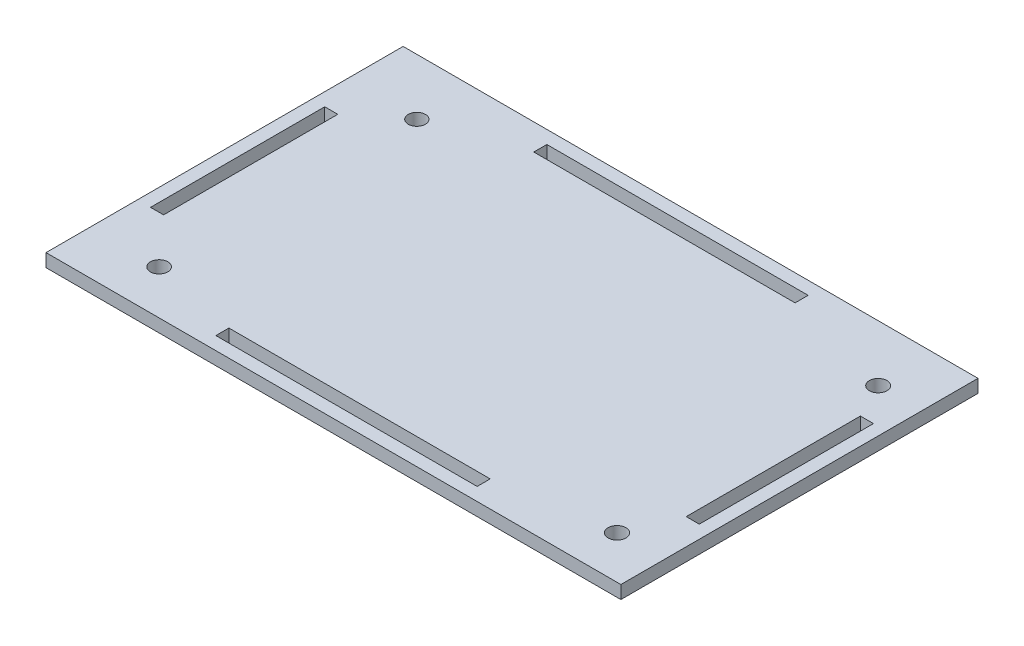
ISO-10303-21;
HEADER;
FILE_DESCRIPTION(('STEP AP214'),'2;1');
FILE_NAME('part.step','',(''),(''),'','','');
FILE_SCHEMA(('AUTOMOTIVE_DESIGN { 1 0 10303 214 1 1 1 1 }'));
ENDSEC;
DATA;
#1=APPLICATION_CONTEXT('core data for automotive mechanical design processes');
#2=APPLICATION_PROTOCOL_DEFINITION('international standard','automotive_design',2000,#1);
#3=PRODUCT_CONTEXT('',#1,'mechanical');
#4=PRODUCT('Part','Part','',(#3));
#5=PRODUCT_RELATED_PRODUCT_CATEGORY('part','',(#4));
#6=PRODUCT_DEFINITION_FORMATION('','',#4);
#7=PRODUCT_DEFINITION_CONTEXT('part definition',#1,'design');
#8=PRODUCT_DEFINITION('design','',#6,#7);
#9=PRODUCT_DEFINITION_SHAPE('','',#8);
#10=(LENGTH_UNIT() NAMED_UNIT(*) SI_UNIT(.MILLI.,.METRE.));
#11=(NAMED_UNIT(*) PLANE_ANGLE_UNIT() SI_UNIT($,.RADIAN.));
#12=(NAMED_UNIT(*) SI_UNIT($,.STERADIAN.) SOLID_ANGLE_UNIT());
#13=UNCERTAINTY_MEASURE_WITH_UNIT(LENGTH_MEASURE(1.E-05),#10,'distance_accuracy_value','');
#14=(GEOMETRIC_REPRESENTATION_CONTEXT(3) GLOBAL_UNCERTAINTY_ASSIGNED_CONTEXT((#13)) GLOBAL_UNIT_ASSIGNED_CONTEXT((#10,
#11,#12)) REPRESENTATION_CONTEXT('',''));
#15=CARTESIAN_POINT('',(0.,0.,0.));
#16=DIRECTION('',(0.,0.,1.));
#17=DIRECTION('',(1.,0.,0.));
#18=AXIS2_PLACEMENT_3D('',#15,#16,#17);
#19=CARTESIAN_POINT('',(0.,3.,0.));
#20=DIRECTION('',(0.,1.,0.));
#21=DIRECTION('',(0.,0.,1.));
#22=AXIS2_PLACEMENT_3D('',#19,#20,#21);
#23=PLANE('',#22);
#24=CARTESIAN_POINT('',(-4.72023304277999,3.,-3.8377562321309));
#25=DIRECTION('',(0.,1.,0.));
#26=DIRECTION('',(0.,0.,1.));
#27=AXIS2_PLACEMENT_3D('',#24,#25,#26);
#28=CIRCLE('',#27,2.04872441547933);
#29=CARTESIAN_POINT('',(-4.72023304277999,3.,-1.78903181665157));
#30=VERTEX_POINT('',#29);
#31=EDGE_CURVE('E652',#30,#30,#28,.T.);
#32=ORIENTED_EDGE('',*,*,#31,.F.);
#33=EDGE_LOOP('',(#32));
#34=FACE_BOUND('',#33,.T.);
#35=CARTESIAN_POINT('',(-110.18079739002,3.,-4.15478389289378));
#36=DIRECTION('',(0.,1.,0.));
#37=DIRECTION('',(0.,0.,1.));
#38=AXIS2_PLACEMENT_3D('',#35,#36,#37);
#39=CIRCLE('',#38,2.00652359482057);
#40=CARTESIAN_POINT('',(-110.18079739002,3.,-2.14826029807322));
#41=VERTEX_POINT('',#40);
#42=EDGE_CURVE('E222',#41,#41,#39,.T.);
#43=ORIENTED_EDGE('',*,*,#42,.F.);
#44=EDGE_LOOP('',(#43));
#45=FACE_BOUND('',#44,.T.);
#46=DIRECTION('',(0.,0.,-1.));
#47=VECTOR('',#46,1.);
#48=CARTESIAN_POINT('',(6.,3.,6.));
#49=LINE('',#48,#47);
#50=CARTESIAN_POINT('',(6.,3.,6.));
#51=VERTEX_POINT('',#50);
#52=CARTESIAN_POINT('',(6.,3.,-76.0000000000001));
#53=VERTEX_POINT('',#52);
#54=EDGE_CURVE('E367',#51,#53,#49,.T.);
#55=ORIENTED_EDGE('',*,*,#54,.T.);
#56=DIRECTION('',(-1.,0.,0.));
#57=VECTOR('',#56,1.);
#58=CARTESIAN_POINT('',(6.,3.,-76.0000000000001));
#59=LINE('',#58,#57);
#60=CARTESIAN_POINT('',(-126.,3.,-76.0000000000001));
#61=VERTEX_POINT('',#60);
#62=EDGE_CURVE('E371',#53,#61,#59,.T.);
#63=ORIENTED_EDGE('',*,*,#62,.T.);
#64=DIRECTION('',(0.,0.,1.));
#65=VECTOR('',#64,1.);
#66=CARTESIAN_POINT('',(-126.,3.,6.));
#67=LINE('',#66,#65);
#68=CARTESIAN_POINT('',(-126.,3.,6.));
#69=VERTEX_POINT('',#68);
#70=EDGE_CURVE('E375',#61,#69,#67,.T.);
#71=ORIENTED_EDGE('',*,*,#70,.T.);
#72=DIRECTION('',(1.,0.,0.));
#73=VECTOR('',#72,1.);
#74=CARTESIAN_POINT('',(6.,3.,6.));
#75=LINE('',#74,#73);
#76=EDGE_CURVE('E378',#69,#51,#75,.T.);
#77=ORIENTED_EDGE('',*,*,#76,.T.);
#78=EDGE_LOOP('',(#55,#63,#71,#77));
#79=FACE_BOUND('',#78,.T.);
#80=DIRECTION('',(1.,0.,0.));
#81=VECTOR('',#80,1.);
#82=CARTESIAN_POINT('',(3.00000000000001,3.,-15.));
#83=LINE('',#82,#81);
#84=CARTESIAN_POINT('',(0.,3.,-15.));
#85=VERTEX_POINT('',#84);
#86=CARTESIAN_POINT('',(3.00000000000001,3.,-15.));
#87=VERTEX_POINT('',#86);
#88=EDGE_CURVE('E327',#85,#87,#83,.T.);
#89=ORIENTED_EDGE('',*,*,#88,.F.);
#90=DIRECTION('',(0.,0.,1.));
#91=VECTOR('',#90,1.);
#92=CARTESIAN_POINT('',(0.,3.,-55.));
#93=LINE('',#92,#91);
#94=CARTESIAN_POINT('',(0.,3.,-55.));
#95=VERTEX_POINT('',#94);
#96=EDGE_CURVE('E324',#95,#85,#93,.T.);
#97=ORIENTED_EDGE('',*,*,#96,.F.);
#98=DIRECTION('',(-1.,0.,0.));
#99=VECTOR('',#98,1.);
#100=CARTESIAN_POINT('',(3.00000000000001,3.,-55.));
#101=LINE('',#100,#99);
#102=CARTESIAN_POINT('',(3.00000000000001,3.,-55.));
#103=VERTEX_POINT('',#102);
#104=EDGE_CURVE('E335',#103,#95,#101,.T.);
#105=ORIENTED_EDGE('',*,*,#104,.F.);
#106=DIRECTION('',(0.,0.,-1.));
#107=VECTOR('',#106,1.);
#108=CARTESIAN_POINT('',(3.00000000000001,3.,-55.));
#109=LINE('',#108,#107);
#110=EDGE_CURVE('E331',#87,#103,#109,.T.);
#111=ORIENTED_EDGE('',*,*,#110,.F.);
#112=EDGE_LOOP('',(#89,#97,#105,#111));
#113=FACE_BOUND('',#112,.T.);
#114=DIRECTION('',(-1.,0.,0.));
#115=VECTOR('',#114,1.);
#116=CARTESIAN_POINT('',(-123.,3.,-55.));
#117=LINE('',#116,#115);
#118=CARTESIAN_POINT('',(-120.,3.,-55.));
#119=VERTEX_POINT('',#118);
#120=CARTESIAN_POINT('',(-123.,3.,-55.));
#121=VERTEX_POINT('',#120);
#122=EDGE_CURVE('E284',#119,#121,#117,.T.);
#123=ORIENTED_EDGE('',*,*,#122,.F.);
#124=DIRECTION('',(0.,0.,-1.));
#125=VECTOR('',#124,1.);
#126=CARTESIAN_POINT('',(-120.,3.,-55.));
#127=LINE('',#126,#125);
#128=CARTESIAN_POINT('',(-120.,3.,-15.));
#129=VERTEX_POINT('',#128);
#130=EDGE_CURVE('E281',#129,#119,#127,.T.);
#131=ORIENTED_EDGE('',*,*,#130,.F.);
#132=DIRECTION('',(1.,0.,0.));
#133=VECTOR('',#132,1.);
#134=CARTESIAN_POINT('',(-123.,3.,-15.));
#135=LINE('',#134,#133);
#136=CARTESIAN_POINT('',(-123.,3.,-15.));
#137=VERTEX_POINT('',#136);
#138=EDGE_CURVE('E292',#137,#129,#135,.T.);
#139=ORIENTED_EDGE('',*,*,#138,.F.);
#140=DIRECTION('',(0.,0.,1.));
#141=VECTOR('',#140,1.);
#142=CARTESIAN_POINT('',(-123.,3.,-55.));
#143=LINE('',#142,#141);
#144=EDGE_CURVE('E288',#121,#137,#143,.T.);
#145=ORIENTED_EDGE('',*,*,#144,.F.);
#146=EDGE_LOOP('',(#123,#131,#139,#145));
#147=FACE_BOUND('',#146,.T.);
#148=DIRECTION('',(1.,0.,0.));
#149=VECTOR('',#148,1.);
#150=CARTESIAN_POINT('',(-29.9999999999999,3.,-70.));
#151=LINE('',#150,#149);
#152=CARTESIAN_POINT('',(-89.9999999999999,3.,-70.));
#153=VERTEX_POINT('',#152);
#154=CARTESIAN_POINT('',(-29.9999999999999,3.,-70.));
#155=VERTEX_POINT('',#154);
#156=EDGE_CURVE('E241',#153,#155,#151,.T.);
#157=ORIENTED_EDGE('',*,*,#156,.F.);
#158=DIRECTION('',(0.,0.,1.));
#159=VECTOR('',#158,1.);
#160=CARTESIAN_POINT('',(-89.9999999999999,3.,-73.0000000000001));
#161=LINE('',#160,#159);
#162=CARTESIAN_POINT('',(-89.9999999999999,3.,-73.0000000000001));
#163=VERTEX_POINT('',#162);
#164=EDGE_CURVE('E238',#163,#153,#161,.T.);
#165=ORIENTED_EDGE('',*,*,#164,.F.);
#166=DIRECTION('',(-1.,0.,0.));
#167=VECTOR('',#166,1.);
#168=CARTESIAN_POINT('',(-29.9999999999999,3.,-73.0000000000001));
#169=LINE('',#168,#167);
#170=CARTESIAN_POINT('',(-29.9999999999999,3.,-73.0000000000001));
#171=VERTEX_POINT('',#170);
#172=EDGE_CURVE('E249',#171,#163,#169,.T.);
#173=ORIENTED_EDGE('',*,*,#172,.F.);
#174=DIRECTION('',(0.,0.,-1.));
#175=VECTOR('',#174,1.);
#176=CARTESIAN_POINT('',(-29.9999999999999,3.,-73.0000000000001));
#177=LINE('',#176,#175);
#178=EDGE_CURVE('E245',#155,#171,#177,.T.);
#179=ORIENTED_EDGE('',*,*,#178,.F.);
#180=EDGE_LOOP('',(#157,#165,#173,#179));
#181=FACE_BOUND('',#180,.T.);
#182=DIRECTION('',(1.,0.,0.));
#183=VECTOR('',#182,1.);
#184=CARTESIAN_POINT('',(-30.,3.,3.00000000000003));
#185=LINE('',#184,#183);
#186=CARTESIAN_POINT('',(-90.,3.,3.00000000000004));
#187=VERTEX_POINT('',#186);
#188=CARTESIAN_POINT('',(-30.,3.,3.00000000000003));
#189=VERTEX_POINT('',#188);
#190=EDGE_CURVE('E196',#187,#189,#185,.T.);
#191=ORIENTED_EDGE('',*,*,#190,.F.);
#192=DIRECTION('',(0.,0.,1.));
#193=VECTOR('',#192,1.);
#194=CARTESIAN_POINT('',(-90.,3.,3.00000000000004));
#195=LINE('',#194,#193);
#196=CARTESIAN_POINT('',(-90.,3.,0.));
#197=VERTEX_POINT('',#196);
#198=EDGE_CURVE('E187',#197,#187,#195,.T.);
#199=ORIENTED_EDGE('',*,*,#198,.F.);
#200=DIRECTION('',(-1.,0.,0.));
#201=VECTOR('',#200,1.);
#202=CARTESIAN_POINT('',(-30.,3.,0.));
#203=LINE('',#202,#201);
#204=CARTESIAN_POINT('',(-30.,3.,0.));
#205=VERTEX_POINT('',#204);
#206=EDGE_CURVE('E214',#205,#197,#203,.T.);
#207=ORIENTED_EDGE('',*,*,#206,.F.);
#208=DIRECTION('',(0.,0.,-1.));
#209=VECTOR('',#208,1.);
#210=CARTESIAN_POINT('',(-30.,3.,3.00000000000003));
#211=LINE('',#210,#209);
#212=EDGE_CURVE('E210',#189,#205,#211,.T.);
#213=ORIENTED_EDGE('',*,*,#212,.F.);
#214=EDGE_LOOP('',(#191,#199,#207,#213));
#215=FACE_BOUND('',#214,.T.);
#216=CARTESIAN_POINT('',(-109.92679739002,3.,-63.0805400952193));
#217=DIRECTION('',(0.,1.,0.));
#218=DIRECTION('',(0.,0.,1.));
#219=AXIS2_PLACEMENT_3D('',#216,#217,#218);
#220=CIRCLE('',#219,1.97380108687728);
#221=CARTESIAN_POINT('',(-109.92679739002,3.,-61.106739008342));
#222=VERTEX_POINT('',#221);
#223=EDGE_CURVE('E660',#222,#222,#220,.T.);
#224=ORIENTED_EDGE('',*,*,#223,.F.);
#225=EDGE_LOOP('',(#224));
#226=FACE_BOUND('',#225,.T.);
#227=CARTESIAN_POINT('',(-4.00427744735476,3.,-63.0805400952193));
#228=DIRECTION('',(0.,1.,0.));
#229=DIRECTION('',(0.,0.,1.));
#230=AXIS2_PLACEMENT_3D('',#227,#228,#229);
#231=CIRCLE('',#230,2.02440774757698);
#232=CARTESIAN_POINT('',(-4.00427744735476,3.,-61.0561323476423));
#233=VERTEX_POINT('',#232);
#234=EDGE_CURVE('E641',#233,#233,#231,.T.);
#235=ORIENTED_EDGE('',*,*,#234,.F.);
#236=EDGE_LOOP('',(#235));
#237=FACE_BOUND('',#236,.T.);
#238=ADVANCED_FACE('F49',(#34,#45,#79,#113,#147,#181,#215,#226,#237),#23,.T.);
#239=CARTESIAN_POINT('',(0.,0.,0.));
#240=DIRECTION('',(0.,1.,0.));
#241=DIRECTION('',(0.,0.,1.));
#242=AXIS2_PLACEMENT_3D('',#239,#240,#241);
#243=PLANE('',#242);
#244=DIRECTION('',(0.,0.,1.));
#245=VECTOR('',#244,1.);
#246=CARTESIAN_POINT('',(-89.9999999999999,0.,-73.0000000000001));
#247=LINE('',#246,#245);
#248=CARTESIAN_POINT('',(-89.9999999999999,0.,-73.0000000000001));
#249=VERTEX_POINT('',#248);
#250=CARTESIAN_POINT('',(-89.9999999999999,0.,-70.));
#251=VERTEX_POINT('',#250);
#252=EDGE_CURVE('E205',#249,#251,#247,.T.);
#253=ORIENTED_EDGE('',*,*,#252,.T.);
#254=DIRECTION('',(1.,0.,0.));
#255=VECTOR('',#254,1.);
#256=CARTESIAN_POINT('',(-29.9999999999999,0.,-70.));
#257=LINE('',#256,#255);
#258=CARTESIAN_POINT('',(-29.9999999999999,0.,-70.));
#259=VERTEX_POINT('',#258);
#260=EDGE_CURVE('E256',#251,#259,#257,.T.);
#261=ORIENTED_EDGE('',*,*,#260,.T.);
#262=DIRECTION('',(0.,0.,-1.));
#263=VECTOR('',#262,1.);
#264=CARTESIAN_POINT('',(-29.9999999999999,0.,-73.0000000000001));
#265=LINE('',#264,#263);
#266=CARTESIAN_POINT('',(-29.9999999999999,0.,-73.0000000000001));
#267=VERTEX_POINT('',#266);
#268=EDGE_CURVE('E260',#259,#267,#265,.T.);
#269=ORIENTED_EDGE('',*,*,#268,.T.);
#270=DIRECTION('',(-1.,0.,0.));
#271=VECTOR('',#270,1.);
#272=CARTESIAN_POINT('',(-29.9999999999999,0.,-73.0000000000001));
#273=LINE('',#272,#271);
#274=EDGE_CURVE('E242',#267,#249,#273,.T.);
#275=ORIENTED_EDGE('',*,*,#274,.T.);
#276=EDGE_LOOP('',(#253,#261,#269,#275));
#277=FACE_BOUND('',#276,.T.);
#278=DIRECTION('',(0.,0.,1.));
#279=VECTOR('',#278,1.);
#280=CARTESIAN_POINT('',(0.,0.,-55.));
#281=LINE('',#280,#279);
#282=CARTESIAN_POINT('',(0.,0.,-55.));
#283=VERTEX_POINT('',#282);
#284=CARTESIAN_POINT('',(0.,0.,-15.));
#285=VERTEX_POINT('',#284);
#286=EDGE_CURVE('E323',#283,#285,#281,.T.);
#287=ORIENTED_EDGE('',*,*,#286,.T.);
#288=DIRECTION('',(1.,0.,0.));
#289=VECTOR('',#288,1.);
#290=CARTESIAN_POINT('',(3.00000000000001,0.,-15.));
#291=LINE('',#290,#289);
#292=CARTESIAN_POINT('',(3.00000000000001,0.,-15.));
#293=VERTEX_POINT('',#292);
#294=EDGE_CURVE('E342',#285,#293,#291,.T.);
#295=ORIENTED_EDGE('',*,*,#294,.T.);
#296=DIRECTION('',(0.,0.,-1.));
#297=VECTOR('',#296,1.);
#298=CARTESIAN_POINT('',(3.00000000000001,0.,-55.));
#299=LINE('',#298,#297);
#300=CARTESIAN_POINT('',(3.00000000000001,0.,-55.));
#301=VERTEX_POINT('',#300);
#302=EDGE_CURVE('E346',#293,#301,#299,.T.);
#303=ORIENTED_EDGE('',*,*,#302,.T.);
#304=DIRECTION('',(-1.,0.,0.));
#305=VECTOR('',#304,1.);
#306=CARTESIAN_POINT('',(3.00000000000001,0.,-55.));
#307=LINE('',#306,#305);
#308=EDGE_CURVE('E328',#301,#283,#307,.T.);
#309=ORIENTED_EDGE('',*,*,#308,.T.);
#310=EDGE_LOOP('',(#287,#295,#303,#309));
#311=FACE_BOUND('',#310,.T.);
#312=DIRECTION('',(0.,0.,-1.));
#313=VECTOR('',#312,1.);
#314=CARTESIAN_POINT('',(6.,0.,6.));
#315=LINE('',#314,#313);
#316=CARTESIAN_POINT('',(6.,0.,6.));
#317=VERTEX_POINT('',#316);
#318=CARTESIAN_POINT('',(6.,0.,-76.0000000000001));
#319=VERTEX_POINT('',#318);
#320=EDGE_CURVE('E366',#317,#319,#315,.T.);
#321=ORIENTED_EDGE('',*,*,#320,.F.);
#322=DIRECTION('',(1.,0.,0.));
#323=VECTOR('',#322,1.);
#324=CARTESIAN_POINT('',(6.,0.,6.));
#325=LINE('',#324,#323);
#326=CARTESIAN_POINT('',(-126.,0.,6.));
#327=VERTEX_POINT('',#326);
#328=EDGE_CURVE('E372',#327,#317,#325,.T.);
#329=ORIENTED_EDGE('',*,*,#328,.F.);
#330=DIRECTION('',(0.,0.,1.));
#331=VECTOR('',#330,1.);
#332=CARTESIAN_POINT('',(-126.,0.,6.));
#333=LINE('',#332,#331);
#334=CARTESIAN_POINT('',(-126.,0.,-76.0000000000001));
#335=VERTEX_POINT('',#334);
#336=EDGE_CURVE('E388',#335,#327,#333,.T.);
#337=ORIENTED_EDGE('',*,*,#336,.F.);
#338=DIRECTION('',(-1.,0.,0.));
#339=VECTOR('',#338,1.);
#340=CARTESIAN_POINT('',(6.,0.,-76.0000000000001));
#341=LINE('',#340,#339);
#342=EDGE_CURVE('E385',#319,#335,#341,.T.);
#343=ORIENTED_EDGE('',*,*,#342,.F.);
#344=EDGE_LOOP('',(#321,#329,#337,#343));
#345=FACE_BOUND('',#344,.T.);
#346=DIRECTION('',(0.,0.,-1.));
#347=VECTOR('',#346,1.);
#348=CARTESIAN_POINT('',(-120.,0.,-55.));
#349=LINE('',#348,#347);
#350=CARTESIAN_POINT('',(-120.,0.,-15.));
#351=VERTEX_POINT('',#350);
#352=CARTESIAN_POINT('',(-120.,0.,-55.));
#353=VERTEX_POINT('',#352);
#354=EDGE_CURVE('E280',#351,#353,#349,.T.);
#355=ORIENTED_EDGE('',*,*,#354,.T.);
#356=DIRECTION('',(-1.,0.,0.));
#357=VECTOR('',#356,1.);
#358=CARTESIAN_POINT('',(-123.,0.,-55.));
#359=LINE('',#358,#357);
#360=CARTESIAN_POINT('',(-123.,0.,-55.));
#361=VERTEX_POINT('',#360);
#362=EDGE_CURVE('E299',#353,#361,#359,.T.);
#363=ORIENTED_EDGE('',*,*,#362,.T.);
#364=DIRECTION('',(0.,0.,1.));
#365=VECTOR('',#364,1.);
#366=CARTESIAN_POINT('',(-123.,0.,-55.));
#367=LINE('',#366,#365);
#368=CARTESIAN_POINT('',(-123.,0.,-15.));
#369=VERTEX_POINT('',#368);
#370=EDGE_CURVE('E303',#361,#369,#367,.T.);
#371=ORIENTED_EDGE('',*,*,#370,.T.);
#372=DIRECTION('',(1.,0.,0.));
#373=VECTOR('',#372,1.);
#374=CARTESIAN_POINT('',(-123.,0.,-15.));
#375=LINE('',#374,#373);
#376=EDGE_CURVE('E285',#369,#351,#375,.T.);
#377=ORIENTED_EDGE('',*,*,#376,.T.);
#378=EDGE_LOOP('',(#355,#363,#371,#377));
#379=FACE_BOUND('',#378,.T.);
#380=DIRECTION('',(0.,0.,1.));
#381=VECTOR('',#380,1.);
#382=CARTESIAN_POINT('',(-90.,0.,3.00000000000004));
#383=LINE('',#382,#381);
#384=CARTESIAN_POINT('',(-90.,0.,0.));
#385=VERTEX_POINT('',#384);
#386=CARTESIAN_POINT('',(-90.,0.,3.00000000000004));
#387=VERTEX_POINT('',#386);
#388=EDGE_CURVE('E73',#385,#387,#383,.T.);
#389=ORIENTED_EDGE('',*,*,#388,.T.);
#390=DIRECTION('',(1.,0.,0.));
#391=VECTOR('',#390,1.);
#392=CARTESIAN_POINT('',(-30.,0.,3.00000000000003));
#393=LINE('',#392,#391);
#394=CARTESIAN_POINT('',(-30.,0.,3.00000000000003));
#395=VERTEX_POINT('',#394);
#396=EDGE_CURVE('E203',#387,#395,#393,.T.);
#397=ORIENTED_EDGE('',*,*,#396,.T.);
#398=DIRECTION('',(0.,0.,-1.));
#399=VECTOR('',#398,1.);
#400=CARTESIAN_POINT('',(-30.,0.,3.00000000000003));
#401=LINE('',#400,#399);
#402=CARTESIAN_POINT('',(-30.,0.,0.));
#403=VERTEX_POINT('',#402);
#404=EDGE_CURVE('E225',#395,#403,#401,.T.);
#405=ORIENTED_EDGE('',*,*,#404,.T.);
#406=DIRECTION('',(-1.,0.,0.));
#407=VECTOR('',#406,1.);
#408=CARTESIAN_POINT('',(-30.,0.,0.));
#409=LINE('',#408,#407);
#410=EDGE_CURVE('E197',#403,#385,#409,.T.);
#411=ORIENTED_EDGE('',*,*,#410,.T.);
#412=EDGE_LOOP('',(#389,#397,#405,#411));
#413=FACE_BOUND('',#412,.T.);
#414=CARTESIAN_POINT('',(-110.18079739002,0.,-4.15478389289378));
#415=DIRECTION('',(0.,1.,0.));
#416=DIRECTION('',(0.,0.,1.));
#417=AXIS2_PLACEMENT_3D('',#414,#415,#416);
#418=CIRCLE('',#417,2.00652359482057);
#419=CARTESIAN_POINT('',(-110.18079739002,0.,-2.14826029807322));
#420=VERTEX_POINT('',#419);
#421=EDGE_CURVE('E664',#420,#420,#418,.T.);
#422=ORIENTED_EDGE('',*,*,#421,.T.);
#423=EDGE_LOOP('',(#422));
#424=FACE_BOUND('',#423,.T.);
#425=CARTESIAN_POINT('',(-109.92679739002,0.,-63.0805400952193));
#426=DIRECTION('',(0.,1.,0.));
#427=DIRECTION('',(0.,0.,1.));
#428=AXIS2_PLACEMENT_3D('',#425,#426,#427);
#429=CIRCLE('',#428,1.97380108687728);
#430=CARTESIAN_POINT('',(-109.92679739002,0.,-61.106739008342));
#431=VERTEX_POINT('',#430);
#432=EDGE_CURVE('E656',#431,#431,#429,.T.);
#433=ORIENTED_EDGE('',*,*,#432,.T.);
#434=EDGE_LOOP('',(#433));
#435=FACE_BOUND('',#434,.T.);
#436=CARTESIAN_POINT('',(-4.72023304277999,0.,-3.8377562321309));
#437=DIRECTION('',(0.,1.,0.));
#438=DIRECTION('',(0.,0.,1.));
#439=AXIS2_PLACEMENT_3D('',#436,#437,#438);
#440=CIRCLE('',#439,2.04872441547933);
#441=CARTESIAN_POINT('',(-4.72023304277999,0.,-1.78903181665157));
#442=VERTEX_POINT('',#441);
#443=EDGE_CURVE('E649',#442,#442,#440,.T.);
#444=ORIENTED_EDGE('',*,*,#443,.T.);
#445=EDGE_LOOP('',(#444));
#446=FACE_BOUND('',#445,.T.);
#447=CARTESIAN_POINT('',(-4.00427744735476,0.,-63.0805400952193));
#448=DIRECTION('',(0.,1.,0.));
#449=DIRECTION('',(0.,0.,1.));
#450=AXIS2_PLACEMENT_3D('',#447,#448,#449);
#451=CIRCLE('',#450,2.02440774757698);
#452=CARTESIAN_POINT('',(-4.00427744735476,0.,-61.0561323476423));
#453=VERTEX_POINT('',#452);
#454=EDGE_CURVE('E644',#453,#453,#451,.T.);
#455=ORIENTED_EDGE('',*,*,#454,.T.);
#456=EDGE_LOOP('',(#455));
#457=FACE_BOUND('',#456,.T.);
#458=ADVANCED_FACE('F411',(#277,#311,#345,#379,#413,#424,#435,#446,#457),#243,.F.);
#459=CARTESIAN_POINT('',(6.,3.,6.));
#460=DIRECTION('',(-1.,0.,0.));
#461=DIRECTION('',(0.,0.,1.));
#462=AXIS2_PLACEMENT_3D('',#459,#460,#461);
#463=PLANE('',#462);
#464=ORIENTED_EDGE('',*,*,#320,.T.);
#465=DIRECTION('',(0.,-1.,0.));
#466=VECTOR('',#465,1.);
#467=CARTESIAN_POINT('',(6.,3.,-76.0000000000001));
#468=LINE('',#467,#466);
#469=EDGE_CURVE('E13',#53,#319,#468,.T.);
#470=ORIENTED_EDGE('',*,*,#469,.F.);
#471=ORIENTED_EDGE('',*,*,#54,.F.);
#472=DIRECTION('',(0.,-1.,0.));
#473=VECTOR('',#472,1.);
#474=CARTESIAN_POINT('',(6.,3.,6.));
#475=LINE('',#474,#473);
#476=EDGE_CURVE('E381',#51,#317,#475,.T.);
#477=ORIENTED_EDGE('',*,*,#476,.T.);
#478=EDGE_LOOP('',(#464,#470,#471,#477));
#479=FACE_BOUND('',#478,.T.);
#480=ADVANCED_FACE('F51',(#479),#463,.F.);
#481=CARTESIAN_POINT('',(6.,3.,-76.0000000000001));
#482=DIRECTION('',(0.,0.,1.));
#483=DIRECTION('',(1.,0.,0.));
#484=AXIS2_PLACEMENT_3D('',#481,#482,#483);
#485=PLANE('',#484);
#486=ORIENTED_EDGE('',*,*,#342,.T.);
#487=DIRECTION('',(0.,-1.,0.));
#488=VECTOR('',#487,1.);
#489=CARTESIAN_POINT('',(-126.,3.,-76.0000000000001));
#490=LINE('',#489,#488);
#491=EDGE_CURVE('E58',#61,#335,#490,.T.);
#492=ORIENTED_EDGE('',*,*,#491,.F.);
#493=ORIENTED_EDGE('',*,*,#62,.F.);
#494=ORIENTED_EDGE('',*,*,#469,.T.);
#495=EDGE_LOOP('',(#486,#492,#493,#494));
#496=FACE_BOUND('',#495,.T.);
#497=ADVANCED_FACE('F422',(#496),#485,.F.);
#498=CARTESIAN_POINT('',(-126.,3.,6.));
#499=DIRECTION('',(1.,0.,0.));
#500=DIRECTION('',(0.,0.,-1.));
#501=AXIS2_PLACEMENT_3D('',#498,#499,#500);
#502=PLANE('',#501);
#503=ORIENTED_EDGE('',*,*,#336,.T.);
#504=DIRECTION('',(0.,-1.,0.));
#505=VECTOR('',#504,1.);
#506=CARTESIAN_POINT('',(-126.,3.,6.));
#507=LINE('',#506,#505);
#508=EDGE_CURVE('E396',#69,#327,#507,.T.);
#509=ORIENTED_EDGE('',*,*,#508,.F.);
#510=ORIENTED_EDGE('',*,*,#70,.F.);
#511=ORIENTED_EDGE('',*,*,#491,.T.);
#512=EDGE_LOOP('',(#503,#509,#510,#511));
#513=FACE_BOUND('',#512,.T.);
#514=ADVANCED_FACE('F405',(#513),#502,.F.);
#515=CARTESIAN_POINT('',(6.,3.,6.));
#516=DIRECTION('',(0.,0.,-1.));
#517=DIRECTION('',(-1.,0.,0.));
#518=AXIS2_PLACEMENT_3D('',#515,#516,#517);
#519=PLANE('',#518);
#520=ORIENTED_EDGE('',*,*,#328,.T.);
#521=ORIENTED_EDGE('',*,*,#476,.F.);
#522=ORIENTED_EDGE('',*,*,#76,.F.);
#523=ORIENTED_EDGE('',*,*,#508,.T.);
#524=EDGE_LOOP('',(#520,#521,#522,#523));
#525=FACE_BOUND('',#524,.T.);
#526=ADVANCED_FACE('F415',(#525),#519,.F.);
#527=CARTESIAN_POINT('',(0.,3.,-55.));
#528=DIRECTION('',(1.,0.,0.));
#529=DIRECTION('',(0.,0.,-1.));
#530=AXIS2_PLACEMENT_3D('',#527,#528,#529);
#531=PLANE('',#530);
#532=ORIENTED_EDGE('',*,*,#286,.F.);
#533=DIRECTION('',(0.,-1.,0.));
#534=VECTOR('',#533,1.);
#535=CARTESIAN_POINT('',(0.,3.,-55.));
#536=LINE('',#535,#534);
#537=EDGE_CURVE('E338',#95,#283,#536,.T.);
#538=ORIENTED_EDGE('',*,*,#537,.F.);
#539=ORIENTED_EDGE('',*,*,#96,.T.);
#540=DIRECTION('',(0.,-1.,0.));
#541=VECTOR('',#540,1.);
#542=CARTESIAN_POINT('',(0.,3.,-15.));
#543=LINE('',#542,#541);
#544=EDGE_CURVE('E362',#85,#285,#543,.T.);
#545=ORIENTED_EDGE('',*,*,#544,.T.);
#546=EDGE_LOOP('',(#532,#538,#539,#545));
#547=FACE_BOUND('',#546,.T.);
#548=ADVANCED_FACE('F440',(#547),#531,.T.);
#549=CARTESIAN_POINT('',(3.00000000000001,3.,-15.));
#550=DIRECTION('',(0.,0.,-1.));
#551=DIRECTION('',(-1.,0.,0.));
#552=AXIS2_PLACEMENT_3D('',#549,#550,#551);
#553=PLANE('',#552);
#554=ORIENTED_EDGE('',*,*,#294,.F.);
#555=ORIENTED_EDGE('',*,*,#544,.F.);
#556=ORIENTED_EDGE('',*,*,#88,.T.);
#557=DIRECTION('',(0.,-1.,0.));
#558=VECTOR('',#557,1.);
#559=CARTESIAN_POINT('',(3.00000000000001,3.,-15.));
#560=LINE('',#559,#558);
#561=EDGE_CURVE('E359',#87,#293,#560,.T.);
#562=ORIENTED_EDGE('',*,*,#561,.T.);
#563=EDGE_LOOP('',(#554,#555,#556,#562));
#564=FACE_BOUND('',#563,.T.);
#565=ADVANCED_FACE('F447',(#564),#553,.T.);
#566=CARTESIAN_POINT('',(3.00000000000001,3.,-55.));
#567=DIRECTION('',(-1.,0.,0.));
#568=DIRECTION('',(0.,0.,1.));
#569=AXIS2_PLACEMENT_3D('',#566,#567,#568);
#570=PLANE('',#569);
#571=ORIENTED_EDGE('',*,*,#302,.F.);
#572=ORIENTED_EDGE('',*,*,#561,.F.);
#573=ORIENTED_EDGE('',*,*,#110,.T.);
#574=DIRECTION('',(0.,-1.,0.));
#575=VECTOR('',#574,1.);
#576=CARTESIAN_POINT('',(3.00000000000001,3.,-55.));
#577=LINE('',#576,#575);
#578=EDGE_CURVE('E356',#103,#301,#577,.T.);
#579=ORIENTED_EDGE('',*,*,#578,.T.);
#580=EDGE_LOOP('',(#571,#572,#573,#579));
#581=FACE_BOUND('',#580,.T.);
#582=ADVANCED_FACE('F452',(#581),#570,.T.);
#583=CARTESIAN_POINT('',(3.00000000000001,3.,-55.));
#584=DIRECTION('',(0.,0.,1.));
#585=DIRECTION('',(1.,0.,0.));
#586=AXIS2_PLACEMENT_3D('',#583,#584,#585);
#587=PLANE('',#586);
#588=ORIENTED_EDGE('',*,*,#308,.F.);
#589=ORIENTED_EDGE('',*,*,#578,.F.);
#590=ORIENTED_EDGE('',*,*,#104,.T.);
#591=ORIENTED_EDGE('',*,*,#537,.T.);
#592=EDGE_LOOP('',(#588,#589,#590,#591));
#593=FACE_BOUND('',#592,.T.);
#594=ADVANCED_FACE('F460',(#593),#587,.T.);
#595=CARTESIAN_POINT('',(-120.,3.,-55.));
#596=DIRECTION('',(-1.,0.,0.));
#597=DIRECTION('',(0.,0.,1.));
#598=AXIS2_PLACEMENT_3D('',#595,#596,#597);
#599=PLANE('',#598);
#600=ORIENTED_EDGE('',*,*,#354,.F.);
#601=DIRECTION('',(0.,-1.,0.));
#602=VECTOR('',#601,1.);
#603=CARTESIAN_POINT('',(-120.,3.,-15.));
#604=LINE('',#603,#602);
#605=EDGE_CURVE('E295',#129,#351,#604,.T.);
#606=ORIENTED_EDGE('',*,*,#605,.F.);
#607=ORIENTED_EDGE('',*,*,#130,.T.);
#608=DIRECTION('',(0.,-1.,0.));
#609=VECTOR('',#608,1.);
#610=CARTESIAN_POINT('',(-120.,3.,-55.));
#611=LINE('',#610,#609);
#612=EDGE_CURVE('E319',#119,#353,#611,.T.);
#613=ORIENTED_EDGE('',*,*,#612,.T.);
#614=EDGE_LOOP('',(#600,#606,#607,#613));
#615=FACE_BOUND('',#614,.T.);
#616=ADVANCED_FACE('F514',(#615),#599,.T.);
#617=CARTESIAN_POINT('',(-123.,3.,-55.));
#618=DIRECTION('',(0.,0.,1.));
#619=DIRECTION('',(1.,0.,0.));
#620=AXIS2_PLACEMENT_3D('',#617,#618,#619);
#621=PLANE('',#620);
#622=ORIENTED_EDGE('',*,*,#362,.F.);
#623=ORIENTED_EDGE('',*,*,#612,.F.);
#624=ORIENTED_EDGE('',*,*,#122,.T.);
#625=DIRECTION('',(0.,-1.,0.));
#626=VECTOR('',#625,1.);
#627=CARTESIAN_POINT('',(-123.,3.,-55.));
#628=LINE('',#627,#626);
#629=EDGE_CURVE('E316',#121,#361,#628,.T.);
#630=ORIENTED_EDGE('',*,*,#629,.T.);
#631=EDGE_LOOP('',(#622,#623,#624,#630));
#632=FACE_BOUND('',#631,.T.);
#633=ADVANCED_FACE('F510',(#632),#621,.T.);
#634=CARTESIAN_POINT('',(-123.,3.,-55.));
#635=DIRECTION('',(1.,0.,0.));
#636=DIRECTION('',(0.,0.,-1.));
#637=AXIS2_PLACEMENT_3D('',#634,#635,#636);
#638=PLANE('',#637);
#639=ORIENTED_EDGE('',*,*,#370,.F.);
#640=ORIENTED_EDGE('',*,*,#629,.F.);
#641=ORIENTED_EDGE('',*,*,#144,.T.);
#642=DIRECTION('',(0.,-1.,0.));
#643=VECTOR('',#642,1.);
#644=CARTESIAN_POINT('',(-123.,3.,-15.));
#645=LINE('',#644,#643);
#646=EDGE_CURVE('E313',#137,#369,#645,.T.);
#647=ORIENTED_EDGE('',*,*,#646,.T.);
#648=EDGE_LOOP('',(#639,#640,#641,#647));
#649=FACE_BOUND('',#648,.T.);
#650=ADVANCED_FACE('F506',(#649),#638,.T.);
#651=CARTESIAN_POINT('',(-123.,3.,-15.));
#652=DIRECTION('',(0.,0.,-1.));
#653=DIRECTION('',(-1.,0.,0.));
#654=AXIS2_PLACEMENT_3D('',#651,#652,#653);
#655=PLANE('',#654);
#656=ORIENTED_EDGE('',*,*,#376,.F.);
#657=ORIENTED_EDGE('',*,*,#646,.F.);
#658=ORIENTED_EDGE('',*,*,#138,.T.);
#659=ORIENTED_EDGE('',*,*,#605,.T.);
#660=EDGE_LOOP('',(#656,#657,#658,#659));
#661=FACE_BOUND('',#660,.T.);
#662=ADVANCED_FACE('F503',(#661),#655,.T.);
#663=CARTESIAN_POINT('',(-89.9999999999999,3.,-73.0000000000001));
#664=DIRECTION('',(1.,0.,0.));
#665=DIRECTION('',(0.,0.,-1.));
#666=AXIS2_PLACEMENT_3D('',#663,#664,#665);
#667=PLANE('',#666);
#668=ORIENTED_EDGE('',*,*,#252,.F.);
#669=DIRECTION('',(0.,-1.,0.));
#670=VECTOR('',#669,1.);
#671=CARTESIAN_POINT('',(-89.9999999999999,3.,-73.0000000000001));
#672=LINE('',#671,#670);
#673=EDGE_CURVE('E252',#163,#249,#672,.T.);
#674=ORIENTED_EDGE('',*,*,#673,.F.);
#675=ORIENTED_EDGE('',*,*,#164,.T.);
#676=DIRECTION('',(0.,-1.,0.));
#677=VECTOR('',#676,1.);
#678=CARTESIAN_POINT('',(-89.9999999999999,3.,-70.));
#679=LINE('',#678,#677);
#680=EDGE_CURVE('E276',#153,#251,#679,.T.);
#681=ORIENTED_EDGE('',*,*,#680,.T.);
#682=EDGE_LOOP('',(#668,#674,#675,#681));
#683=FACE_BOUND('',#682,.T.);
#684=ADVANCED_FACE('F485',(#683),#667,.T.);
#685=CARTESIAN_POINT('',(-29.9999999999999,3.,-70.));
#686=DIRECTION('',(0.,0.,-1.));
#687=DIRECTION('',(-1.,0.,0.));
#688=AXIS2_PLACEMENT_3D('',#685,#686,#687);
#689=PLANE('',#688);
#690=ORIENTED_EDGE('',*,*,#260,.F.);
#691=ORIENTED_EDGE('',*,*,#680,.F.);
#692=ORIENTED_EDGE('',*,*,#156,.T.);
#693=DIRECTION('',(0.,-1.,0.));
#694=VECTOR('',#693,1.);
#695=CARTESIAN_POINT('',(-29.9999999999999,3.,-70.));
#696=LINE('',#695,#694);
#697=EDGE_CURVE('E273',#155,#259,#696,.T.);
#698=ORIENTED_EDGE('',*,*,#697,.T.);
#699=EDGE_LOOP('',(#690,#691,#692,#698));
#700=FACE_BOUND('',#699,.T.);
#701=ADVANCED_FACE('F479',(#700),#689,.T.);
#702=CARTESIAN_POINT('',(-29.9999999999999,3.,-73.0000000000001));
#703=DIRECTION('',(-1.,0.,0.));
#704=DIRECTION('',(0.,0.,1.));
#705=AXIS2_PLACEMENT_3D('',#702,#703,#704);
#706=PLANE('',#705);
#707=ORIENTED_EDGE('',*,*,#268,.F.);
#708=ORIENTED_EDGE('',*,*,#697,.F.);
#709=ORIENTED_EDGE('',*,*,#178,.T.);
#710=DIRECTION('',(0.,-1.,0.));
#711=VECTOR('',#710,1.);
#712=CARTESIAN_POINT('',(-29.9999999999999,3.,-73.0000000000001));
#713=LINE('',#712,#711);
#714=EDGE_CURVE('E270',#171,#267,#713,.T.);
#715=ORIENTED_EDGE('',*,*,#714,.T.);
#716=EDGE_LOOP('',(#707,#708,#709,#715));
#717=FACE_BOUND('',#716,.T.);
#718=ADVANCED_FACE('F482',(#717),#706,.T.);
#719=CARTESIAN_POINT('',(-29.9999999999999,3.,-73.0000000000001));
#720=DIRECTION('',(0.,0.,1.));
#721=DIRECTION('',(1.,0.,0.));
#722=AXIS2_PLACEMENT_3D('',#719,#720,#721);
#723=PLANE('',#722);
#724=ORIENTED_EDGE('',*,*,#274,.F.);
#725=ORIENTED_EDGE('',*,*,#714,.F.);
#726=ORIENTED_EDGE('',*,*,#172,.T.);
#727=ORIENTED_EDGE('',*,*,#673,.T.);
#728=EDGE_LOOP('',(#724,#725,#726,#727));
#729=FACE_BOUND('',#728,.T.);
#730=ADVANCED_FACE('F488',(#729),#723,.T.);
#731=CARTESIAN_POINT('',(-90.,3.,3.00000000000004));
#732=DIRECTION('',(1.,0.,0.));
#733=DIRECTION('',(0.,0.,-1.));
#734=AXIS2_PLACEMENT_3D('',#731,#732,#733);
#735=PLANE('',#734);
#736=ORIENTED_EDGE('',*,*,#388,.F.);
#737=DIRECTION('',(0.,-1.,0.));
#738=VECTOR('',#737,1.);
#739=CARTESIAN_POINT('',(-90.,3.,0.));
#740=LINE('',#739,#738);
#741=EDGE_CURVE('E191',#197,#385,#740,.T.);
#742=ORIENTED_EDGE('',*,*,#741,.F.);
#743=ORIENTED_EDGE('',*,*,#198,.T.);
#744=DIRECTION('',(0.,-1.,0.));
#745=VECTOR('',#744,1.);
#746=CARTESIAN_POINT('',(-90.,3.,3.00000000000004));
#747=LINE('',#746,#745);
#748=EDGE_CURVE('E190',#187,#387,#747,.T.);
#749=ORIENTED_EDGE('',*,*,#748,.T.);
#750=EDGE_LOOP('',(#736,#742,#743,#749));
#751=FACE_BOUND('',#750,.T.);
#752=ADVANCED_FACE('F189',(#751),#735,.T.);
#753=CARTESIAN_POINT('',(-30.,3.,3.00000000000003));
#754=DIRECTION('',(0.,0.,-1.));
#755=DIRECTION('',(-1.,0.,0.));
#756=AXIS2_PLACEMENT_3D('',#753,#754,#755);
#757=PLANE('',#756);
#758=ORIENTED_EDGE('',*,*,#396,.F.);
#759=ORIENTED_EDGE('',*,*,#748,.F.);
#760=ORIENTED_EDGE('',*,*,#190,.T.);
#761=DIRECTION('',(0.,-1.,0.));
#762=VECTOR('',#761,1.);
#763=CARTESIAN_POINT('',(-30.,3.,3.00000000000003));
#764=LINE('',#763,#762);
#765=EDGE_CURVE('E206',#189,#395,#764,.T.);
#766=ORIENTED_EDGE('',*,*,#765,.T.);
#767=EDGE_LOOP('',(#758,#759,#760,#766));
#768=FACE_BOUND('',#767,.T.);
#769=ADVANCED_FACE('F200',(#768),#757,.T.);
#770=CARTESIAN_POINT('',(-30.,3.,3.00000000000003));
#771=DIRECTION('',(-1.,0.,0.));
#772=DIRECTION('',(0.,0.,1.));
#773=AXIS2_PLACEMENT_3D('',#770,#771,#772);
#774=PLANE('',#773);
#775=ORIENTED_EDGE('',*,*,#404,.F.);
#776=ORIENTED_EDGE('',*,*,#765,.F.);
#777=ORIENTED_EDGE('',*,*,#212,.T.);
#778=DIRECTION('',(0.,-1.,0.));
#779=VECTOR('',#778,1.);
#780=CARTESIAN_POINT('',(-30.,3.,0.));
#781=LINE('',#780,#779);
#782=EDGE_CURVE('E65',#205,#403,#781,.T.);
#783=ORIENTED_EDGE('',*,*,#782,.T.);
#784=EDGE_LOOP('',(#775,#776,#777,#783));
#785=FACE_BOUND('',#784,.T.);
#786=ADVANCED_FACE('F577',(#785),#774,.T.);
#787=CARTESIAN_POINT('',(-30.,3.,0.));
#788=DIRECTION('',(0.,0.,1.));
#789=DIRECTION('',(1.,0.,0.));
#790=AXIS2_PLACEMENT_3D('',#787,#788,#789);
#791=PLANE('',#790);
#792=ORIENTED_EDGE('',*,*,#410,.F.);
#793=ORIENTED_EDGE('',*,*,#782,.F.);
#794=ORIENTED_EDGE('',*,*,#206,.T.);
#795=ORIENTED_EDGE('',*,*,#741,.T.);
#796=EDGE_LOOP('',(#792,#793,#794,#795));
#797=FACE_BOUND('',#796,.T.);
#798=ADVANCED_FACE('F585',(#797),#791,.T.);
#799=CARTESIAN_POINT('',(-110.18079739002,3.,-4.15478389289378));
#800=DIRECTION('',(0.,-1.,0.));
#801=DIRECTION('',(0.,0.,-1.));
#802=AXIS2_PLACEMENT_3D('',#799,#800,#801);
#803=CYLINDRICAL_SURFACE('',#802,2.00652359482057);
#804=ORIENTED_EDGE('',*,*,#42,.T.);
#805=EDGE_LOOP('',(#804));
#806=FACE_BOUND('',#805,.T.);
#807=ORIENTED_EDGE('',*,*,#421,.F.);
#808=EDGE_LOOP('',(#807));
#809=FACE_BOUND('',#808,.T.);
#810=ADVANCED_FACE('F595',(#806,#809),#803,.F.);
#811=CARTESIAN_POINT('',(-109.92679739002,3.,-63.0805400952193));
#812=DIRECTION('',(0.,-1.,0.));
#813=DIRECTION('',(0.,0.,-1.));
#814=AXIS2_PLACEMENT_3D('',#811,#812,#813);
#815=CYLINDRICAL_SURFACE('',#814,1.97380108687728);
#816=ORIENTED_EDGE('',*,*,#223,.T.);
#817=EDGE_LOOP('',(#816));
#818=FACE_BOUND('',#817,.T.);
#819=ORIENTED_EDGE('',*,*,#432,.F.);
#820=EDGE_LOOP('',(#819));
#821=FACE_BOUND('',#820,.T.);
#822=ADVANCED_FACE('F604',(#818,#821),#815,.F.);
#823=CARTESIAN_POINT('',(-4.72023304277999,3.,-3.8377562321309));
#824=DIRECTION('',(0.,-1.,0.));
#825=DIRECTION('',(0.,0.,-1.));
#826=AXIS2_PLACEMENT_3D('',#823,#824,#825);
#827=CYLINDRICAL_SURFACE('',#826,2.04872441547933);
#828=ORIENTED_EDGE('',*,*,#31,.T.);
#829=EDGE_LOOP('',(#828));
#830=FACE_BOUND('',#829,.T.);
#831=ORIENTED_EDGE('',*,*,#443,.F.);
#832=EDGE_LOOP('',(#831));
#833=FACE_BOUND('',#832,.T.);
#834=ADVANCED_FACE('F614',(#830,#833),#827,.F.);
#835=CARTESIAN_POINT('',(-4.00427744735476,3.,-63.0805400952193));
#836=DIRECTION('',(0.,-1.,0.));
#837=DIRECTION('',(0.,0.,-1.));
#838=AXIS2_PLACEMENT_3D('',#835,#836,#837);
#839=CYLINDRICAL_SURFACE('',#838,2.02440774757698);
#840=ORIENTED_EDGE('',*,*,#234,.T.);
#841=EDGE_LOOP('',(#840));
#842=FACE_BOUND('',#841,.T.);
#843=ORIENTED_EDGE('',*,*,#454,.F.);
#844=EDGE_LOOP('',(#843));
#845=FACE_BOUND('',#844,.T.);
#846=ADVANCED_FACE('F624',(#842,#845),#839,.F.);
#847=CLOSED_SHELL('',(#238,#458,#480,#497,#514,#526,#548,#565,#582,#594,#616,#633,#650,#662,
#684,#701,#718,#730,#752,#769,#786,#798,#810,#822,#834,#846));
#848=MANIFOLD_SOLID_BREP('B2',#847);
#849=ADVANCED_BREP_SHAPE_REPRESENTATION('',(#18,#848),#14);
#850=SHAPE_DEFINITION_REPRESENTATION(#9,#849);
ENDSEC;
END-ISO-10303-21;
